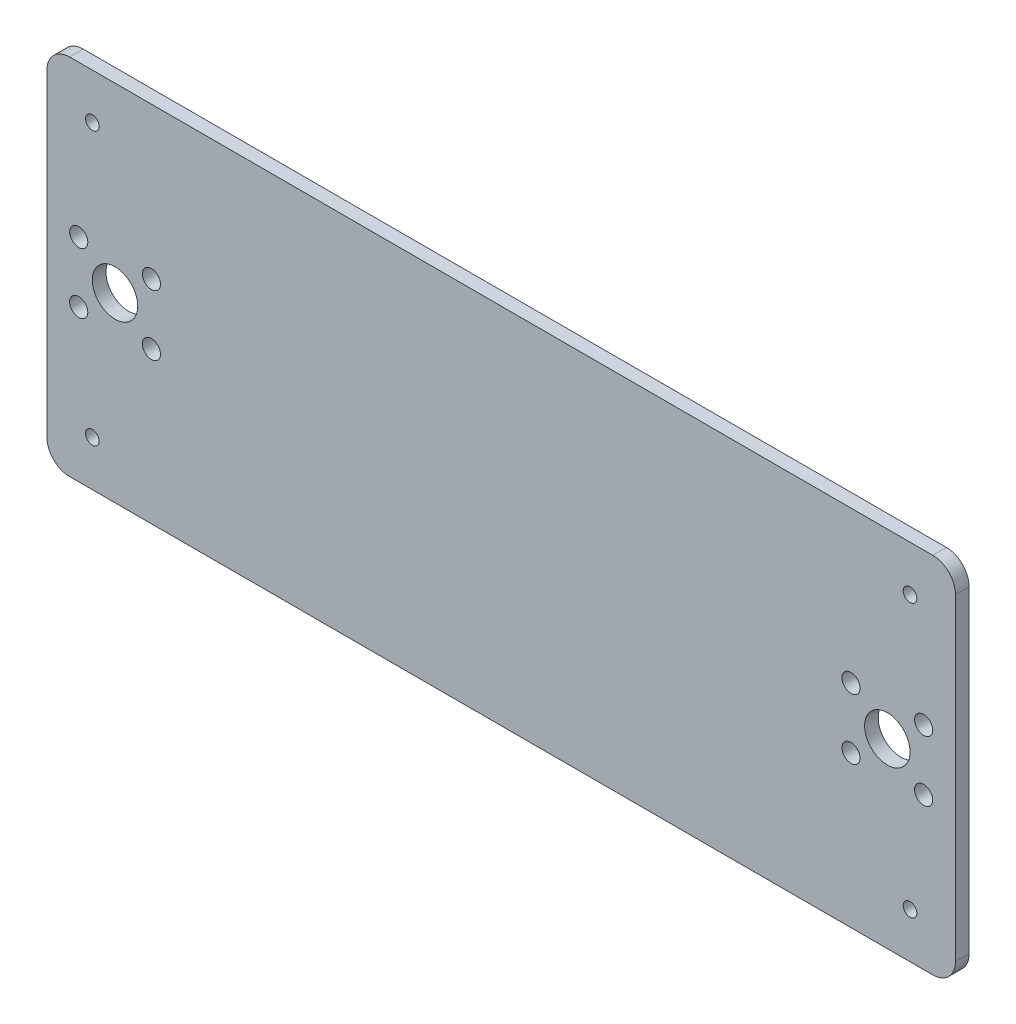
ISO-10303-21;
HEADER;
FILE_DESCRIPTION(('STEP AP214'),'2;1');
FILE_NAME('part.step','',(''),(''),'','','');
FILE_SCHEMA(('AUTOMOTIVE_DESIGN { 1 0 10303 214 1 1 1 1 }'));
ENDSEC;
DATA;
#1=APPLICATION_CONTEXT('core data for automotive mechanical design processes');
#2=APPLICATION_PROTOCOL_DEFINITION('international standard','automotive_design',2000,#1);
#3=PRODUCT_CONTEXT('',#1,'mechanical');
#4=PRODUCT('Part','Part','',(#3));
#5=PRODUCT_RELATED_PRODUCT_CATEGORY('part','',(#4));
#6=PRODUCT_DEFINITION_FORMATION('','',#4);
#7=PRODUCT_DEFINITION_CONTEXT('part definition',#1,'design');
#8=PRODUCT_DEFINITION('design','',#6,#7);
#9=PRODUCT_DEFINITION_SHAPE('','',#8);
#10=(LENGTH_UNIT() NAMED_UNIT(*) SI_UNIT(.MILLI.,.METRE.));
#11=(NAMED_UNIT(*) PLANE_ANGLE_UNIT() SI_UNIT($,.RADIAN.));
#12=(NAMED_UNIT(*) SI_UNIT($,.STERADIAN.) SOLID_ANGLE_UNIT());
#13=UNCERTAINTY_MEASURE_WITH_UNIT(LENGTH_MEASURE(1.E-05),#10,'distance_accuracy_value','');
#14=(GEOMETRIC_REPRESENTATION_CONTEXT(3) GLOBAL_UNCERTAINTY_ASSIGNED_CONTEXT((#13)) GLOBAL_UNIT_ASSIGNED_CONTEXT((#10,
#11,#12)) REPRESENTATION_CONTEXT('',''));
#15=CARTESIAN_POINT('',(0.,0.,0.));
#16=DIRECTION('',(0.,0.,1.));
#17=DIRECTION('',(1.,0.,0.));
#18=AXIS2_PLACEMENT_3D('',#15,#16,#17);
#19=CARTESIAN_POINT('',(95.,35.,3.));
#20=DIRECTION('',(0.,0.,1.));
#21=DIRECTION('',(1.,0.,0.));
#22=AXIS2_PLACEMENT_3D('',#19,#20,#21);
#23=PLANE('',#22);
#24=CARTESIAN_POINT('',(-93.,6.67,3.));
#25=DIRECTION('',(0.,0.,1.));
#26=DIRECTION('',(-1.,0.,0.));
#27=AXIS2_PLACEMENT_3D('',#24,#25,#26);
#28=CIRCLE('',#27,1.99999999999994);
#29=CARTESIAN_POINT('',(-94.9999999999999,6.67,3.));
#30=VERTEX_POINT('',#29);
#31=EDGE_CURVE('E251',#30,#30,#28,.T.);
#32=ORIENTED_EDGE('',*,*,#31,.F.);
#33=EDGE_LOOP('',(#32));
#34=FACE_BOUND('',#33,.T.);
#35=CARTESIAN_POINT('',(-77.,-6.67,3.));
#36=DIRECTION('',(0.,0.,1.));
#37=DIRECTION('',(1.,0.,0.));
#38=AXIS2_PLACEMENT_3D('',#35,#36,#37);
#39=CIRCLE('',#38,2.);
#40=CARTESIAN_POINT('',(-75.,-6.67,3.));
#41=VERTEX_POINT('',#40);
#42=EDGE_CURVE('E239',#41,#41,#39,.T.);
#43=ORIENTED_EDGE('',*,*,#42,.F.);
#44=EDGE_LOOP('',(#43));
#45=FACE_BOUND('',#44,.T.);
#46=CARTESIAN_POINT('',(77.,-6.67,3.));
#47=DIRECTION('',(0.,0.,1.));
#48=DIRECTION('',(-1.,0.,0.));
#49=AXIS2_PLACEMENT_3D('',#46,#47,#48);
#50=CIRCLE('',#49,2.);
#51=CARTESIAN_POINT('',(75.,-6.67,3.));
#52=VERTEX_POINT('',#51);
#53=EDGE_CURVE('E227',#52,#52,#50,.T.);
#54=ORIENTED_EDGE('',*,*,#53,.F.);
#55=EDGE_LOOP('',(#54));
#56=FACE_BOUND('',#55,.T.);
#57=CARTESIAN_POINT('',(93.,6.67,3.));
#58=DIRECTION('',(0.,0.,1.));
#59=DIRECTION('',(1.,0.,0.));
#60=AXIS2_PLACEMENT_3D('',#57,#58,#59);
#61=CIRCLE('',#60,1.99999999999994);
#62=CARTESIAN_POINT('',(94.9999999999999,6.67,3.));
#63=VERTEX_POINT('',#62);
#64=EDGE_CURVE('E215',#63,#63,#61,.T.);
#65=ORIENTED_EDGE('',*,*,#64,.F.);
#66=EDGE_LOOP('',(#65));
#67=FACE_BOUND('',#66,.T.);
#68=CARTESIAN_POINT('',(-85.,0.,3.));
#69=DIRECTION('',(0.,0.,1.));
#70=DIRECTION('',(1.,0.,0.));
#71=AXIS2_PLACEMENT_3D('',#68,#69,#70);
#72=CIRCLE('',#71,5.);
#73=CARTESIAN_POINT('',(-80.,0.,3.));
#74=VERTEX_POINT('',#73);
#75=EDGE_CURVE('E203',#74,#74,#72,.T.);
#76=ORIENTED_EDGE('',*,*,#75,.F.);
#77=EDGE_LOOP('',(#76));
#78=FACE_BOUND('',#77,.T.);
#79=CARTESIAN_POINT('',(90.0000000000006,-30.,3.));
#80=DIRECTION('',(0.,0.,1.));
#81=DIRECTION('',(1.,0.,0.));
#82=AXIS2_PLACEMENT_3D('',#79,#80,#81);
#83=CIRCLE('',#82,1.5);
#84=CARTESIAN_POINT('',(91.5000000000006,-30.,3.));
#85=VERTEX_POINT('',#84);
#86=EDGE_CURVE('E191',#85,#85,#83,.T.);
#87=ORIENTED_EDGE('',*,*,#86,.F.);
#88=EDGE_LOOP('',(#87));
#89=FACE_BOUND('',#88,.T.);
#90=CARTESIAN_POINT('',(-90.,30.,3.));
#91=DIRECTION('',(0.,0.,1.));
#92=DIRECTION('',(1.,0.,0.));
#93=AXIS2_PLACEMENT_3D('',#90,#91,#92);
#94=CIRCLE('',#93,1.5);
#95=CARTESIAN_POINT('',(-88.5,30.,3.));
#96=VERTEX_POINT('',#95);
#97=EDGE_CURVE('E137',#96,#96,#94,.T.);
#98=ORIENTED_EDGE('',*,*,#97,.F.);
#99=EDGE_LOOP('',(#98));
#100=FACE_BOUND('',#99,.T.);
#101=CARTESIAN_POINT('',(95.,35.,3.));
#102=DIRECTION('',(0.,0.,1.));
#103=DIRECTION('',(1.,0.,0.));
#104=AXIS2_PLACEMENT_3D('',#101,#102,#103);
#105=CIRCLE('',#104,5.);
#106=CARTESIAN_POINT('',(100.,35.,3.));
#107=VERTEX_POINT('',#106);
#108=CARTESIAN_POINT('',(95.,40.,3.));
#109=VERTEX_POINT('',#108);
#110=EDGE_CURVE('E148',#107,#109,#105,.T.);
#111=ORIENTED_EDGE('',*,*,#110,.T.);
#112=DIRECTION('',(-1.,0.,0.));
#113=VECTOR('',#112,1.);
#114=CARTESIAN_POINT('',(95.,40.,3.));
#115=LINE('',#114,#113);
#116=CARTESIAN_POINT('',(-95.,40.,3.));
#117=VERTEX_POINT('',#116);
#118=EDGE_CURVE('E96',#109,#117,#115,.T.);
#119=ORIENTED_EDGE('',*,*,#118,.T.);
#120=CARTESIAN_POINT('',(-95.,35.,3.));
#121=DIRECTION('',(0.,0.,1.));
#122=DIRECTION('',(1.,0.,0.));
#123=AXIS2_PLACEMENT_3D('',#120,#121,#122);
#124=CIRCLE('',#123,5.);
#125=CARTESIAN_POINT('',(-100.,35.,3.));
#126=VERTEX_POINT('',#125);
#127=EDGE_CURVE('E163',#117,#126,#124,.T.);
#128=ORIENTED_EDGE('',*,*,#127,.T.);
#129=DIRECTION('',(0.,-1.,0.));
#130=VECTOR('',#129,1.);
#131=CARTESIAN_POINT('',(-100.,-35.,3.));
#132=LINE('',#131,#130);
#133=CARTESIAN_POINT('',(-100.,-35.,3.));
#134=VERTEX_POINT('',#133);
#135=EDGE_CURVE('E176',#126,#134,#132,.T.);
#136=ORIENTED_EDGE('',*,*,#135,.T.);
#137=CARTESIAN_POINT('',(-95.,-35.,3.));
#138=DIRECTION('',(0.,0.,1.));
#139=DIRECTION('',(-1.,0.,0.));
#140=AXIS2_PLACEMENT_3D('',#137,#138,#139);
#141=CIRCLE('',#140,5.);
#142=CARTESIAN_POINT('',(-95.,-40.,3.));
#143=VERTEX_POINT('',#142);
#144=EDGE_CURVE('E115',#134,#143,#141,.T.);
#145=ORIENTED_EDGE('',*,*,#144,.T.);
#146=DIRECTION('',(1.,0.,0.));
#147=VECTOR('',#146,1.);
#148=CARTESIAN_POINT('',(95.,-40.,3.));
#149=LINE('',#148,#147);
#150=CARTESIAN_POINT('',(95.,-40.,3.));
#151=VERTEX_POINT('',#150);
#152=EDGE_CURVE('E109',#143,#151,#149,.T.);
#153=ORIENTED_EDGE('',*,*,#152,.T.);
#154=CARTESIAN_POINT('',(95.,-35.,3.));
#155=DIRECTION('',(0.,0.,1.));
#156=DIRECTION('',(1.,0.,0.));
#157=AXIS2_PLACEMENT_3D('',#154,#155,#156);
#158=CIRCLE('',#157,5.);
#159=CARTESIAN_POINT('',(100.,-35.,3.));
#160=VERTEX_POINT('',#159);
#161=EDGE_CURVE('E113',#151,#160,#158,.T.);
#162=ORIENTED_EDGE('',*,*,#161,.T.);
#163=DIRECTION('',(0.,1.,0.));
#164=VECTOR('',#163,1.);
#165=CARTESIAN_POINT('',(100.,-35.,3.));
#166=LINE('',#165,#164);
#167=EDGE_CURVE('E53',#160,#107,#166,.T.);
#168=ORIENTED_EDGE('',*,*,#167,.T.);
#169=EDGE_LOOP('',(#111,#119,#128,#136,#145,#153,#162,#168));
#170=FACE_BOUND('',#169,.T.);
#171=CARTESIAN_POINT('',(90.,30.,3.));
#172=DIRECTION('',(0.,0.,1.));
#173=DIRECTION('',(1.,0.,0.));
#174=AXIS2_PLACEMENT_3D('',#171,#172,#173);
#175=CIRCLE('',#174,1.5);
#176=CARTESIAN_POINT('',(91.5,30.,3.));
#177=VERTEX_POINT('',#176);
#178=EDGE_CURVE('E185',#177,#177,#175,.T.);
#179=ORIENTED_EDGE('',*,*,#178,.F.);
#180=EDGE_LOOP('',(#179));
#181=FACE_BOUND('',#180,.T.);
#182=CARTESIAN_POINT('',(-89.9999999999994,-30.,3.));
#183=DIRECTION('',(0.,0.,1.));
#184=DIRECTION('',(1.,0.,0.));
#185=AXIS2_PLACEMENT_3D('',#182,#183,#184);
#186=CIRCLE('',#185,1.5);
#187=CARTESIAN_POINT('',(-88.4999999999994,-30.,3.));
#188=VERTEX_POINT('',#187);
#189=EDGE_CURVE('E197',#188,#188,#186,.T.);
#190=ORIENTED_EDGE('',*,*,#189,.F.);
#191=EDGE_LOOP('',(#190));
#192=FACE_BOUND('',#191,.T.);
#193=CARTESIAN_POINT('',(85.,0.,3.));
#194=DIRECTION('',(0.,0.,1.));
#195=DIRECTION('',(1.,0.,0.));
#196=AXIS2_PLACEMENT_3D('',#193,#194,#195);
#197=CIRCLE('',#196,5.);
#198=CARTESIAN_POINT('',(90.,0.,3.));
#199=VERTEX_POINT('',#198);
#200=EDGE_CURVE('E209',#199,#199,#197,.T.);
#201=ORIENTED_EDGE('',*,*,#200,.F.);
#202=EDGE_LOOP('',(#201));
#203=FACE_BOUND('',#202,.T.);
#204=CARTESIAN_POINT('',(93.,-6.67,3.));
#205=DIRECTION('',(0.,0.,1.));
#206=DIRECTION('',(1.,0.,0.));
#207=AXIS2_PLACEMENT_3D('',#204,#205,#206);
#208=CIRCLE('',#207,2.);
#209=CARTESIAN_POINT('',(95.,-6.67,3.));
#210=VERTEX_POINT('',#209);
#211=EDGE_CURVE('E221',#210,#210,#208,.T.);
#212=ORIENTED_EDGE('',*,*,#211,.F.);
#213=EDGE_LOOP('',(#212));
#214=FACE_BOUND('',#213,.T.);
#215=CARTESIAN_POINT('',(77.,6.67,3.));
#216=DIRECTION('',(0.,0.,1.));
#217=DIRECTION('',(-1.,0.,0.));
#218=AXIS2_PLACEMENT_3D('',#215,#216,#217);
#219=CIRCLE('',#218,1.99999999999994);
#220=CARTESIAN_POINT('',(75.0000000000001,6.67,3.));
#221=VERTEX_POINT('',#220);
#222=EDGE_CURVE('E233',#221,#221,#219,.T.);
#223=ORIENTED_EDGE('',*,*,#222,.F.);
#224=EDGE_LOOP('',(#223));
#225=FACE_BOUND('',#224,.T.);
#226=CARTESIAN_POINT('',(-93.,-6.67,3.));
#227=DIRECTION('',(0.,0.,1.));
#228=DIRECTION('',(-1.,0.,0.));
#229=AXIS2_PLACEMENT_3D('',#226,#227,#228);
#230=CIRCLE('',#229,2.);
#231=CARTESIAN_POINT('',(-95.,-6.67,3.));
#232=VERTEX_POINT('',#231);
#233=EDGE_CURVE('E245',#232,#232,#230,.T.);
#234=ORIENTED_EDGE('',*,*,#233,.F.);
#235=EDGE_LOOP('',(#234));
#236=FACE_BOUND('',#235,.T.);
#237=CARTESIAN_POINT('',(-77.,6.67,3.));
#238=DIRECTION('',(0.,0.,1.));
#239=DIRECTION('',(1.,0.,0.));
#240=AXIS2_PLACEMENT_3D('',#237,#238,#239);
#241=CIRCLE('',#240,1.99999999999994);
#242=CARTESIAN_POINT('',(-75.0000000000001,6.67,3.));
#243=VERTEX_POINT('',#242);
#244=EDGE_CURVE('E257',#243,#243,#241,.T.);
#245=ORIENTED_EDGE('',*,*,#244,.F.);
#246=EDGE_LOOP('',(#245));
#247=FACE_BOUND('',#246,.T.);
#248=ADVANCED_FACE('F36',(#34,#45,#56,#67,#78,#89,#100,#170,#181,#192,#203,#214,#225,#236,#247),
#23,.T.);
#249=CARTESIAN_POINT('',(95.,35.,0.));
#250=DIRECTION('',(0.,0.,1.));
#251=DIRECTION('',(1.,0.,0.));
#252=AXIS2_PLACEMENT_3D('',#249,#250,#251);
#253=PLANE('',#252);
#254=CARTESIAN_POINT('',(95.,35.,0.));
#255=DIRECTION('',(0.,0.,1.));
#256=DIRECTION('',(1.,0.,0.));
#257=AXIS2_PLACEMENT_3D('',#254,#255,#256);
#258=CIRCLE('',#257,5.);
#259=CARTESIAN_POINT('',(100.,35.,0.));
#260=VERTEX_POINT('',#259);
#261=CARTESIAN_POINT('',(95.,40.,0.));
#262=VERTEX_POINT('',#261);
#263=EDGE_CURVE('E133',#260,#262,#258,.T.);
#264=ORIENTED_EDGE('',*,*,#263,.F.);
#265=DIRECTION('',(0.,1.,0.));
#266=VECTOR('',#265,1.);
#267=CARTESIAN_POINT('',(100.,-35.,0.));
#268=LINE('',#267,#266);
#269=CARTESIAN_POINT('',(100.,-35.,0.));
#270=VERTEX_POINT('',#269);
#271=EDGE_CURVE('E88',#270,#260,#268,.T.);
#272=ORIENTED_EDGE('',*,*,#271,.F.);
#273=CARTESIAN_POINT('',(95.,-35.,0.));
#274=DIRECTION('',(0.,0.,1.));
#275=DIRECTION('',(1.,0.,0.));
#276=AXIS2_PLACEMENT_3D('',#273,#274,#275);
#277=CIRCLE('',#276,5.);
#278=CARTESIAN_POINT('',(95.,-40.,0.));
#279=VERTEX_POINT('',#278);
#280=EDGE_CURVE('E82',#279,#270,#277,.T.);
#281=ORIENTED_EDGE('',*,*,#280,.F.);
#282=DIRECTION('',(1.,0.,0.));
#283=VECTOR('',#282,1.);
#284=CARTESIAN_POINT('',(95.,-40.,0.));
#285=LINE('',#284,#283);
#286=CARTESIAN_POINT('',(-95.,-40.,0.));
#287=VERTEX_POINT('',#286);
#288=EDGE_CURVE('E123',#287,#279,#285,.T.);
#289=ORIENTED_EDGE('',*,*,#288,.F.);
#290=CARTESIAN_POINT('',(-95.,-35.,0.));
#291=DIRECTION('',(0.,0.,1.));
#292=DIRECTION('',(-1.,0.,0.));
#293=AXIS2_PLACEMENT_3D('',#290,#291,#292);
#294=CIRCLE('',#293,5.);
#295=CARTESIAN_POINT('',(-100.,-35.,0.));
#296=VERTEX_POINT('',#295);
#297=EDGE_CURVE('E143',#296,#287,#294,.T.);
#298=ORIENTED_EDGE('',*,*,#297,.F.);
#299=DIRECTION('',(0.,-1.,0.));
#300=VECTOR('',#299,1.);
#301=CARTESIAN_POINT('',(-100.,-35.,0.));
#302=LINE('',#301,#300);
#303=CARTESIAN_POINT('',(-100.,35.,0.));
#304=VERTEX_POINT('',#303);
#305=EDGE_CURVE('E141',#304,#296,#302,.T.);
#306=ORIENTED_EDGE('',*,*,#305,.F.);
#307=CARTESIAN_POINT('',(-95.,35.,0.));
#308=DIRECTION('',(0.,0.,1.));
#309=DIRECTION('',(1.,0.,0.));
#310=AXIS2_PLACEMENT_3D('',#307,#308,#309);
#311=CIRCLE('',#310,5.);
#312=CARTESIAN_POINT('',(-95.,40.,0.));
#313=VERTEX_POINT('',#312);
#314=EDGE_CURVE('E139',#313,#304,#311,.T.);
#315=ORIENTED_EDGE('',*,*,#314,.F.);
#316=DIRECTION('',(-1.,0.,0.));
#317=VECTOR('',#316,1.);
#318=CARTESIAN_POINT('',(95.,40.,0.));
#319=LINE('',#318,#317);
#320=EDGE_CURVE('E136',#262,#313,#319,.T.);
#321=ORIENTED_EDGE('',*,*,#320,.F.);
#322=EDGE_LOOP('',(#264,#272,#281,#289,#298,#306,#315,#321));
#323=FACE_BOUND('',#322,.T.);
#324=CARTESIAN_POINT('',(-90.,30.,0.));
#325=DIRECTION('',(0.,0.,1.));
#326=DIRECTION('',(1.,0.,0.));
#327=AXIS2_PLACEMENT_3D('',#324,#325,#326);
#328=CIRCLE('',#327,1.5);
#329=CARTESIAN_POINT('',(-88.5,30.,0.));
#330=VERTEX_POINT('',#329);
#331=EDGE_CURVE('E182',#330,#330,#328,.T.);
#332=ORIENTED_EDGE('',*,*,#331,.T.);
#333=EDGE_LOOP('',(#332));
#334=FACE_BOUND('',#333,.T.);
#335=CARTESIAN_POINT('',(90.,30.,0.));
#336=DIRECTION('',(0.,0.,1.));
#337=DIRECTION('',(1.,0.,0.));
#338=AXIS2_PLACEMENT_3D('',#335,#336,#337);
#339=CIRCLE('',#338,1.5);
#340=CARTESIAN_POINT('',(91.5,30.,0.));
#341=VERTEX_POINT('',#340);
#342=EDGE_CURVE('E188',#341,#341,#339,.T.);
#343=ORIENTED_EDGE('',*,*,#342,.T.);
#344=EDGE_LOOP('',(#343));
#345=FACE_BOUND('',#344,.T.);
#346=CARTESIAN_POINT('',(90.0000000000006,-30.,0.));
#347=DIRECTION('',(0.,0.,1.));
#348=DIRECTION('',(1.,0.,0.));
#349=AXIS2_PLACEMENT_3D('',#346,#347,#348);
#350=CIRCLE('',#349,1.5);
#351=CARTESIAN_POINT('',(91.5000000000006,-30.,0.));
#352=VERTEX_POINT('',#351);
#353=EDGE_CURVE('E194',#352,#352,#350,.T.);
#354=ORIENTED_EDGE('',*,*,#353,.T.);
#355=EDGE_LOOP('',(#354));
#356=FACE_BOUND('',#355,.T.);
#357=CARTESIAN_POINT('',(-89.9999999999994,-30.,0.));
#358=DIRECTION('',(0.,0.,1.));
#359=DIRECTION('',(1.,0.,0.));
#360=AXIS2_PLACEMENT_3D('',#357,#358,#359);
#361=CIRCLE('',#360,1.5);
#362=CARTESIAN_POINT('',(-88.4999999999994,-30.,0.));
#363=VERTEX_POINT('',#362);
#364=EDGE_CURVE('E200',#363,#363,#361,.T.);
#365=ORIENTED_EDGE('',*,*,#364,.T.);
#366=EDGE_LOOP('',(#365));
#367=FACE_BOUND('',#366,.T.);
#368=CARTESIAN_POINT('',(-85.,0.,0.));
#369=DIRECTION('',(0.,0.,1.));
#370=DIRECTION('',(1.,0.,0.));
#371=AXIS2_PLACEMENT_3D('',#368,#369,#370);
#372=CIRCLE('',#371,5.);
#373=CARTESIAN_POINT('',(-80.,0.,0.));
#374=VERTEX_POINT('',#373);
#375=EDGE_CURVE('E206',#374,#374,#372,.T.);
#376=ORIENTED_EDGE('',*,*,#375,.T.);
#377=EDGE_LOOP('',(#376));
#378=FACE_BOUND('',#377,.T.);
#379=CARTESIAN_POINT('',(85.,0.,0.));
#380=DIRECTION('',(0.,0.,1.));
#381=DIRECTION('',(1.,0.,0.));
#382=AXIS2_PLACEMENT_3D('',#379,#380,#381);
#383=CIRCLE('',#382,5.);
#384=CARTESIAN_POINT('',(90.,0.,0.));
#385=VERTEX_POINT('',#384);
#386=EDGE_CURVE('E212',#385,#385,#383,.T.);
#387=ORIENTED_EDGE('',*,*,#386,.T.);
#388=EDGE_LOOP('',(#387));
#389=FACE_BOUND('',#388,.T.);
#390=CARTESIAN_POINT('',(93.,6.67,0.));
#391=DIRECTION('',(0.,0.,1.));
#392=DIRECTION('',(1.,0.,0.));
#393=AXIS2_PLACEMENT_3D('',#390,#391,#392);
#394=CIRCLE('',#393,1.99999999999994);
#395=CARTESIAN_POINT('',(94.9999999999999,6.67,0.));
#396=VERTEX_POINT('',#395);
#397=EDGE_CURVE('E218',#396,#396,#394,.T.);
#398=ORIENTED_EDGE('',*,*,#397,.T.);
#399=EDGE_LOOP('',(#398));
#400=FACE_BOUND('',#399,.T.);
#401=CARTESIAN_POINT('',(93.,-6.67,0.));
#402=DIRECTION('',(0.,0.,1.));
#403=DIRECTION('',(1.,0.,0.));
#404=AXIS2_PLACEMENT_3D('',#401,#402,#403);
#405=CIRCLE('',#404,2.);
#406=CARTESIAN_POINT('',(95.,-6.67,0.));
#407=VERTEX_POINT('',#406);
#408=EDGE_CURVE('E224',#407,#407,#405,.T.);
#409=ORIENTED_EDGE('',*,*,#408,.T.);
#410=EDGE_LOOP('',(#409));
#411=FACE_BOUND('',#410,.T.);
#412=CARTESIAN_POINT('',(77.,-6.67,0.));
#413=DIRECTION('',(0.,0.,1.));
#414=DIRECTION('',(-1.,0.,0.));
#415=AXIS2_PLACEMENT_3D('',#412,#413,#414);
#416=CIRCLE('',#415,2.);
#417=CARTESIAN_POINT('',(75.,-6.67,0.));
#418=VERTEX_POINT('',#417);
#419=EDGE_CURVE('E230',#418,#418,#416,.T.);
#420=ORIENTED_EDGE('',*,*,#419,.T.);
#421=EDGE_LOOP('',(#420));
#422=FACE_BOUND('',#421,.T.);
#423=CARTESIAN_POINT('',(77.,6.67,0.));
#424=DIRECTION('',(0.,0.,1.));
#425=DIRECTION('',(-1.,0.,0.));
#426=AXIS2_PLACEMENT_3D('',#423,#424,#425);
#427=CIRCLE('',#426,1.99999999999994);
#428=CARTESIAN_POINT('',(75.0000000000001,6.67,0.));
#429=VERTEX_POINT('',#428);
#430=EDGE_CURVE('E236',#429,#429,#427,.T.);
#431=ORIENTED_EDGE('',*,*,#430,.T.);
#432=EDGE_LOOP('',(#431));
#433=FACE_BOUND('',#432,.T.);
#434=CARTESIAN_POINT('',(-77.,-6.67,0.));
#435=DIRECTION('',(0.,0.,1.));
#436=DIRECTION('',(1.,0.,0.));
#437=AXIS2_PLACEMENT_3D('',#434,#435,#436);
#438=CIRCLE('',#437,2.);
#439=CARTESIAN_POINT('',(-75.,-6.67,0.));
#440=VERTEX_POINT('',#439);
#441=EDGE_CURVE('E242',#440,#440,#438,.T.);
#442=ORIENTED_EDGE('',*,*,#441,.T.);
#443=EDGE_LOOP('',(#442));
#444=FACE_BOUND('',#443,.T.);
#445=CARTESIAN_POINT('',(-93.,-6.67,0.));
#446=DIRECTION('',(0.,0.,1.));
#447=DIRECTION('',(-1.,0.,0.));
#448=AXIS2_PLACEMENT_3D('',#445,#446,#447);
#449=CIRCLE('',#448,2.);
#450=CARTESIAN_POINT('',(-95.,-6.67,0.));
#451=VERTEX_POINT('',#450);
#452=EDGE_CURVE('E248',#451,#451,#449,.T.);
#453=ORIENTED_EDGE('',*,*,#452,.T.);
#454=EDGE_LOOP('',(#453));
#455=FACE_BOUND('',#454,.T.);
#456=CARTESIAN_POINT('',(-93.,6.67,0.));
#457=DIRECTION('',(0.,0.,1.));
#458=DIRECTION('',(-1.,0.,0.));
#459=AXIS2_PLACEMENT_3D('',#456,#457,#458);
#460=CIRCLE('',#459,1.99999999999994);
#461=CARTESIAN_POINT('',(-94.9999999999999,6.67,0.));
#462=VERTEX_POINT('',#461);
#463=EDGE_CURVE('E254',#462,#462,#460,.T.);
#464=ORIENTED_EDGE('',*,*,#463,.T.);
#465=EDGE_LOOP('',(#464));
#466=FACE_BOUND('',#465,.T.);
#467=CARTESIAN_POINT('',(-77.,6.67,0.));
#468=DIRECTION('',(0.,0.,1.));
#469=DIRECTION('',(1.,0.,0.));
#470=AXIS2_PLACEMENT_3D('',#467,#468,#469);
#471=CIRCLE('',#470,1.99999999999994);
#472=CARTESIAN_POINT('',(-75.0000000000001,6.67,0.));
#473=VERTEX_POINT('',#472);
#474=EDGE_CURVE('E260',#473,#473,#471,.T.);
#475=ORIENTED_EDGE('',*,*,#474,.T.);
#476=EDGE_LOOP('',(#475));
#477=FACE_BOUND('',#476,.T.);
#478=ADVANCED_FACE('F167',(#323,#334,#345,#356,#367,#378,#389,#400,#411,#422,#433,#444,#455,
#466,#477),#253,.F.);
#479=CARTESIAN_POINT('',(95.,35.,3.));
#480=DIRECTION('',(0.,0.,-1.));
#481=DIRECTION('',(-1.,0.,0.));
#482=AXIS2_PLACEMENT_3D('',#479,#480,#481);
#483=CYLINDRICAL_SURFACE('',#482,5.);
#484=ORIENTED_EDGE('',*,*,#263,.T.);
#485=DIRECTION('',(0.,0.,-1.));
#486=VECTOR('',#485,1.);
#487=CARTESIAN_POINT('',(95.,40.,3.));
#488=LINE('',#487,#486);
#489=EDGE_CURVE('E11',#109,#262,#488,.T.);
#490=ORIENTED_EDGE('',*,*,#489,.F.);
#491=ORIENTED_EDGE('',*,*,#110,.F.);
#492=DIRECTION('',(0.,0.,-1.));
#493=VECTOR('',#492,1.);
#494=CARTESIAN_POINT('',(100.,35.,3.));
#495=LINE('',#494,#493);
#496=EDGE_CURVE('E129',#107,#260,#495,.T.);
#497=ORIENTED_EDGE('',*,*,#496,.T.);
#498=EDGE_LOOP('',(#484,#490,#491,#497));
#499=FACE_BOUND('',#498,.T.);
#500=ADVANCED_FACE('F38',(#499),#483,.T.);
#501=CARTESIAN_POINT('',(95.,40.,3.));
#502=DIRECTION('',(0.,-1.,0.));
#503=DIRECTION('',(1.,0.,0.));
#504=AXIS2_PLACEMENT_3D('',#501,#502,#503);
#505=PLANE('',#504);
#506=ORIENTED_EDGE('',*,*,#320,.T.);
#507=DIRECTION('',(0.,0.,-1.));
#508=VECTOR('',#507,1.);
#509=CARTESIAN_POINT('',(-95.,40.,3.));
#510=LINE('',#509,#508);
#511=EDGE_CURVE('E45',#117,#313,#510,.T.);
#512=ORIENTED_EDGE('',*,*,#511,.F.);
#513=ORIENTED_EDGE('',*,*,#118,.F.);
#514=ORIENTED_EDGE('',*,*,#489,.T.);
#515=EDGE_LOOP('',(#506,#512,#513,#514));
#516=FACE_BOUND('',#515,.T.);
#517=ADVANCED_FACE('F294',(#516),#505,.F.);
#518=CARTESIAN_POINT('',(-95.,35.,3.));
#519=DIRECTION('',(0.,0.,-1.));
#520=DIRECTION('',(-1.,0.,0.));
#521=AXIS2_PLACEMENT_3D('',#518,#519,#520);
#522=CYLINDRICAL_SURFACE('',#521,5.);
#523=ORIENTED_EDGE('',*,*,#314,.T.);
#524=DIRECTION('',(0.,0.,-1.));
#525=VECTOR('',#524,1.);
#526=CARTESIAN_POINT('',(-100.,35.,3.));
#527=LINE('',#526,#525);
#528=EDGE_CURVE('E155',#126,#304,#527,.T.);
#529=ORIENTED_EDGE('',*,*,#528,.F.);
#530=ORIENTED_EDGE('',*,*,#127,.F.);
#531=ORIENTED_EDGE('',*,*,#511,.T.);
#532=EDGE_LOOP('',(#523,#529,#530,#531));
#533=FACE_BOUND('',#532,.T.);
#534=ADVANCED_FACE('F161',(#533),#522,.T.);
#535=CARTESIAN_POINT('',(-100.,-35.,3.));
#536=DIRECTION('',(1.,0.,0.));
#537=DIRECTION('',(0.,0.,-1.));
#538=AXIS2_PLACEMENT_3D('',#535,#536,#537);
#539=PLANE('',#538);
#540=ORIENTED_EDGE('',*,*,#305,.T.);
#541=DIRECTION('',(0.,0.,-1.));
#542=VECTOR('',#541,1.);
#543=CARTESIAN_POINT('',(-100.,-35.,3.));
#544=LINE('',#543,#542);
#545=EDGE_CURVE('E152',#134,#296,#544,.T.);
#546=ORIENTED_EDGE('',*,*,#545,.F.);
#547=ORIENTED_EDGE('',*,*,#135,.F.);
#548=ORIENTED_EDGE('',*,*,#528,.T.);
#549=EDGE_LOOP('',(#540,#546,#547,#548));
#550=FACE_BOUND('',#549,.T.);
#551=ADVANCED_FACE('F172',(#550),#539,.F.);
#552=CARTESIAN_POINT('',(-95.,-35.,3.));
#553=DIRECTION('',(0.,0.,-1.));
#554=DIRECTION('',(-1.,0.,0.));
#555=AXIS2_PLACEMENT_3D('',#552,#553,#554);
#556=CYLINDRICAL_SURFACE('',#555,5.);
#557=ORIENTED_EDGE('',*,*,#297,.T.);
#558=DIRECTION('',(0.,0.,-1.));
#559=VECTOR('',#558,1.);
#560=CARTESIAN_POINT('',(-95.,-40.,3.));
#561=LINE('',#560,#559);
#562=EDGE_CURVE('E124',#143,#287,#561,.T.);
#563=ORIENTED_EDGE('',*,*,#562,.F.);
#564=ORIENTED_EDGE('',*,*,#144,.F.);
#565=ORIENTED_EDGE('',*,*,#545,.T.);
#566=EDGE_LOOP('',(#557,#563,#564,#565));
#567=FACE_BOUND('',#566,.T.);
#568=ADVANCED_FACE('F175',(#567),#556,.T.);
#569=CARTESIAN_POINT('',(95.,-40.,3.));
#570=DIRECTION('',(0.,1.,0.));
#571=DIRECTION('',(-1.,0.,0.));
#572=AXIS2_PLACEMENT_3D('',#569,#570,#571);
#573=PLANE('',#572);
#574=ORIENTED_EDGE('',*,*,#288,.T.);
#575=DIRECTION('',(0.,0.,-1.));
#576=VECTOR('',#575,1.);
#577=CARTESIAN_POINT('',(95.,-40.,3.));
#578=LINE('',#577,#576);
#579=EDGE_CURVE('E120',#151,#279,#578,.T.);
#580=ORIENTED_EDGE('',*,*,#579,.F.);
#581=ORIENTED_EDGE('',*,*,#152,.F.);
#582=ORIENTED_EDGE('',*,*,#562,.T.);
#583=EDGE_LOOP('',(#574,#580,#581,#582));
#584=FACE_BOUND('',#583,.T.);
#585=ADVANCED_FACE('F121',(#584),#573,.F.);
#586=CARTESIAN_POINT('',(95.,-35.,3.));
#587=DIRECTION('',(0.,0.,-1.));
#588=DIRECTION('',(-1.,0.,0.));
#589=AXIS2_PLACEMENT_3D('',#586,#587,#588);
#590=CYLINDRICAL_SURFACE('',#589,5.);
#591=ORIENTED_EDGE('',*,*,#280,.T.);
#592=DIRECTION('',(0.,0.,-1.));
#593=VECTOR('',#592,1.);
#594=CARTESIAN_POINT('',(100.,-35.,3.));
#595=LINE('',#594,#593);
#596=EDGE_CURVE('E125',#160,#270,#595,.T.);
#597=ORIENTED_EDGE('',*,*,#596,.F.);
#598=ORIENTED_EDGE('',*,*,#161,.F.);
#599=ORIENTED_EDGE('',*,*,#579,.T.);
#600=EDGE_LOOP('',(#591,#597,#598,#599));
#601=FACE_BOUND('',#600,.T.);
#602=ADVANCED_FACE('F127',(#601),#590,.T.);
#603=CARTESIAN_POINT('',(100.,-35.,3.));
#604=DIRECTION('',(-1.,0.,0.));
#605=DIRECTION('',(0.,0.,1.));
#606=AXIS2_PLACEMENT_3D('',#603,#604,#605);
#607=PLANE('',#606);
#608=ORIENTED_EDGE('',*,*,#271,.T.);
#609=ORIENTED_EDGE('',*,*,#496,.F.);
#610=ORIENTED_EDGE('',*,*,#167,.F.);
#611=ORIENTED_EDGE('',*,*,#596,.T.);
#612=EDGE_LOOP('',(#608,#609,#610,#611));
#613=FACE_BOUND('',#612,.T.);
#614=ADVANCED_FACE('F282',(#613),#607,.F.);
#615=CARTESIAN_POINT('',(-90.,30.,3.));
#616=DIRECTION('',(0.,0.,-1.));
#617=DIRECTION('',(-1.,0.,0.));
#618=AXIS2_PLACEMENT_3D('',#615,#616,#617);
#619=CYLINDRICAL_SURFACE('',#618,1.5);
#620=ORIENTED_EDGE('',*,*,#97,.T.);
#621=EDGE_LOOP('',(#620));
#622=FACE_BOUND('',#621,.T.);
#623=ORIENTED_EDGE('',*,*,#331,.F.);
#624=EDGE_LOOP('',(#623));
#625=FACE_BOUND('',#624,.T.);
#626=ADVANCED_FACE('F279',(#622,#625),#619,.F.);
#627=CARTESIAN_POINT('',(90.,30.,3.));
#628=DIRECTION('',(0.,0.,-1.));
#629=DIRECTION('',(-1.,0.,0.));
#630=AXIS2_PLACEMENT_3D('',#627,#628,#629);
#631=CYLINDRICAL_SURFACE('',#630,1.5);
#632=ORIENTED_EDGE('',*,*,#178,.T.);
#633=EDGE_LOOP('',(#632));
#634=FACE_BOUND('',#633,.T.);
#635=ORIENTED_EDGE('',*,*,#342,.F.);
#636=EDGE_LOOP('',(#635));
#637=FACE_BOUND('',#636,.T.);
#638=ADVANCED_FACE('F358',(#634,#637),#631,.F.);
#639=CARTESIAN_POINT('',(90.0000000000006,-30.,3.));
#640=DIRECTION('',(0.,0.,-1.));
#641=DIRECTION('',(-1.,0.,0.));
#642=AXIS2_PLACEMENT_3D('',#639,#640,#641);
#643=CYLINDRICAL_SURFACE('',#642,1.5);
#644=ORIENTED_EDGE('',*,*,#86,.T.);
#645=EDGE_LOOP('',(#644));
#646=FACE_BOUND('',#645,.T.);
#647=ORIENTED_EDGE('',*,*,#353,.F.);
#648=EDGE_LOOP('',(#647));
#649=FACE_BOUND('',#648,.T.);
#650=ADVANCED_FACE('F366',(#646,#649),#643,.F.);
#651=CARTESIAN_POINT('',(-89.9999999999994,-30.,3.));
#652=DIRECTION('',(0.,0.,-1.));
#653=DIRECTION('',(-1.,0.,0.));
#654=AXIS2_PLACEMENT_3D('',#651,#652,#653);
#655=CYLINDRICAL_SURFACE('',#654,1.5);
#656=ORIENTED_EDGE('',*,*,#189,.T.);
#657=EDGE_LOOP('',(#656));
#658=FACE_BOUND('',#657,.T.);
#659=ORIENTED_EDGE('',*,*,#364,.F.);
#660=EDGE_LOOP('',(#659));
#661=FACE_BOUND('',#660,.T.);
#662=ADVANCED_FACE('F374',(#658,#661),#655,.F.);
#663=CARTESIAN_POINT('',(-85.,0.,3.));
#664=DIRECTION('',(0.,0.,-1.));
#665=DIRECTION('',(-1.,0.,0.));
#666=AXIS2_PLACEMENT_3D('',#663,#664,#665);
#667=CYLINDRICAL_SURFACE('',#666,5.);
#668=ORIENTED_EDGE('',*,*,#75,.T.);
#669=EDGE_LOOP('',(#668));
#670=FACE_BOUND('',#669,.T.);
#671=ORIENTED_EDGE('',*,*,#375,.F.);
#672=EDGE_LOOP('',(#671));
#673=FACE_BOUND('',#672,.T.);
#674=ADVANCED_FACE('F383',(#670,#673),#667,.F.);
#675=CARTESIAN_POINT('',(85.,0.,3.));
#676=DIRECTION('',(0.,0.,-1.));
#677=DIRECTION('',(-1.,0.,0.));
#678=AXIS2_PLACEMENT_3D('',#675,#676,#677);
#679=CYLINDRICAL_SURFACE('',#678,5.);
#680=ORIENTED_EDGE('',*,*,#200,.T.);
#681=EDGE_LOOP('',(#680));
#682=FACE_BOUND('',#681,.T.);
#683=ORIENTED_EDGE('',*,*,#386,.F.);
#684=EDGE_LOOP('',(#683));
#685=FACE_BOUND('',#684,.T.);
#686=ADVANCED_FACE('F392',(#682,#685),#679,.F.);
#687=CARTESIAN_POINT('',(93.,6.67,3.));
#688=DIRECTION('',(0.,0.,-1.));
#689=DIRECTION('',(-1.,0.,0.));
#690=AXIS2_PLACEMENT_3D('',#687,#688,#689);
#691=CYLINDRICAL_SURFACE('',#690,1.99999999999994);
#692=ORIENTED_EDGE('',*,*,#64,.T.);
#693=EDGE_LOOP('',(#692));
#694=FACE_BOUND('',#693,.T.);
#695=ORIENTED_EDGE('',*,*,#397,.F.);
#696=EDGE_LOOP('',(#695));
#697=FACE_BOUND('',#696,.T.);
#698=ADVANCED_FACE('F401',(#694,#697),#691,.F.);
#699=CARTESIAN_POINT('',(93.,-6.67,3.));
#700=DIRECTION('',(0.,0.,-1.));
#701=DIRECTION('',(-1.,0.,0.));
#702=AXIS2_PLACEMENT_3D('',#699,#700,#701);
#703=CYLINDRICAL_SURFACE('',#702,2.);
#704=ORIENTED_EDGE('',*,*,#211,.T.);
#705=EDGE_LOOP('',(#704));
#706=FACE_BOUND('',#705,.T.);
#707=ORIENTED_EDGE('',*,*,#408,.F.);
#708=EDGE_LOOP('',(#707));
#709=FACE_BOUND('',#708,.T.);
#710=ADVANCED_FACE('F410',(#706,#709),#703,.F.);
#711=CARTESIAN_POINT('',(77.,-6.67,3.));
#712=DIRECTION('',(0.,0.,-1.));
#713=DIRECTION('',(-1.,0.,0.));
#714=AXIS2_PLACEMENT_3D('',#711,#712,#713);
#715=CYLINDRICAL_SURFACE('',#714,2.);
#716=ORIENTED_EDGE('',*,*,#53,.T.);
#717=EDGE_LOOP('',(#716));
#718=FACE_BOUND('',#717,.T.);
#719=ORIENTED_EDGE('',*,*,#419,.F.);
#720=EDGE_LOOP('',(#719));
#721=FACE_BOUND('',#720,.T.);
#722=ADVANCED_FACE('F419',(#718,#721),#715,.F.);
#723=CARTESIAN_POINT('',(77.,6.67,3.));
#724=DIRECTION('',(0.,0.,-1.));
#725=DIRECTION('',(-1.,0.,0.));
#726=AXIS2_PLACEMENT_3D('',#723,#724,#725);
#727=CYLINDRICAL_SURFACE('',#726,1.99999999999994);
#728=ORIENTED_EDGE('',*,*,#222,.T.);
#729=EDGE_LOOP('',(#728));
#730=FACE_BOUND('',#729,.T.);
#731=ORIENTED_EDGE('',*,*,#430,.F.);
#732=EDGE_LOOP('',(#731));
#733=FACE_BOUND('',#732,.T.);
#734=ADVANCED_FACE('F428',(#730,#733),#727,.F.);
#735=CARTESIAN_POINT('',(-77.,-6.67,3.));
#736=DIRECTION('',(0.,0.,-1.));
#737=DIRECTION('',(-1.,0.,0.));
#738=AXIS2_PLACEMENT_3D('',#735,#736,#737);
#739=CYLINDRICAL_SURFACE('',#738,2.);
#740=ORIENTED_EDGE('',*,*,#42,.T.);
#741=EDGE_LOOP('',(#740));
#742=FACE_BOUND('',#741,.T.);
#743=ORIENTED_EDGE('',*,*,#441,.F.);
#744=EDGE_LOOP('',(#743));
#745=FACE_BOUND('',#744,.T.);
#746=ADVANCED_FACE('F437',(#742,#745),#739,.F.);
#747=CARTESIAN_POINT('',(-93.,-6.67,3.));
#748=DIRECTION('',(0.,0.,-1.));
#749=DIRECTION('',(-1.,0.,0.));
#750=AXIS2_PLACEMENT_3D('',#747,#748,#749);
#751=CYLINDRICAL_SURFACE('',#750,2.);
#752=ORIENTED_EDGE('',*,*,#233,.T.);
#753=EDGE_LOOP('',(#752));
#754=FACE_BOUND('',#753,.T.);
#755=ORIENTED_EDGE('',*,*,#452,.F.);
#756=EDGE_LOOP('',(#755));
#757=FACE_BOUND('',#756,.T.);
#758=ADVANCED_FACE('F446',(#754,#757),#751,.F.);
#759=CARTESIAN_POINT('',(-93.,6.67,3.));
#760=DIRECTION('',(0.,0.,-1.));
#761=DIRECTION('',(-1.,0.,0.));
#762=AXIS2_PLACEMENT_3D('',#759,#760,#761);
#763=CYLINDRICAL_SURFACE('',#762,1.99999999999994);
#764=ORIENTED_EDGE('',*,*,#31,.T.);
#765=EDGE_LOOP('',(#764));
#766=FACE_BOUND('',#765,.T.);
#767=ORIENTED_EDGE('',*,*,#463,.F.);
#768=EDGE_LOOP('',(#767));
#769=FACE_BOUND('',#768,.T.);
#770=ADVANCED_FACE('F455',(#766,#769),#763,.F.);
#771=CARTESIAN_POINT('',(-77.,6.67,3.));
#772=DIRECTION('',(0.,0.,-1.));
#773=DIRECTION('',(-1.,0.,0.));
#774=AXIS2_PLACEMENT_3D('',#771,#772,#773);
#775=CYLINDRICAL_SURFACE('',#774,1.99999999999994);
#776=ORIENTED_EDGE('',*,*,#244,.T.);
#777=EDGE_LOOP('',(#776));
#778=FACE_BOUND('',#777,.T.);
#779=ORIENTED_EDGE('',*,*,#474,.F.);
#780=EDGE_LOOP('',(#779));
#781=FACE_BOUND('',#780,.T.);
#782=ADVANCED_FACE('F266',(#778,#781),#775,.F.);
#783=CLOSED_SHELL('',(#248,#478,#500,#517,#534,#551,#568,#585,#602,#614,#626,#638,#650,#662,
#674,#686,#698,#710,#722,#734,#746,#758,#770,#782));
#784=MANIFOLD_SOLID_BREP('B2',#783);
#785=ADVANCED_BREP_SHAPE_REPRESENTATION('',(#18,#784),#14);
#786=SHAPE_DEFINITION_REPRESENTATION(#9,#785);
ENDSEC;
END-ISO-10303-21;
